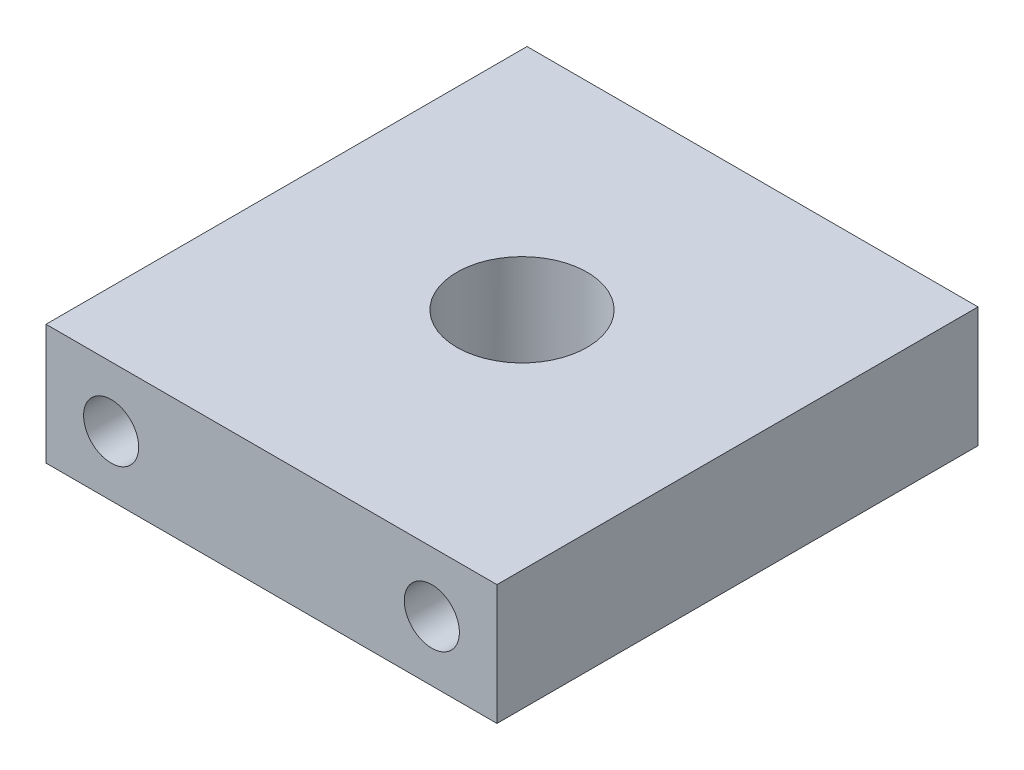
ISO-10303-21;
HEADER;
FILE_DESCRIPTION(('STEP AP214'),'2;1');
FILE_NAME('part.step','',(''),(''),'','','');
FILE_SCHEMA(('AUTOMOTIVE_DESIGN { 1 0 10303 214 1 1 1 1 }'));
ENDSEC;
DATA;
#1=APPLICATION_CONTEXT('core data for automotive mechanical design processes');
#2=APPLICATION_PROTOCOL_DEFINITION('international standard','automotive_design',2000,#1);
#3=PRODUCT_CONTEXT('',#1,'mechanical');
#4=PRODUCT('Part','Part','',(#3));
#5=PRODUCT_RELATED_PRODUCT_CATEGORY('part','',(#4));
#6=PRODUCT_DEFINITION_FORMATION('','',#4);
#7=PRODUCT_DEFINITION_CONTEXT('part definition',#1,'design');
#8=PRODUCT_DEFINITION('design','',#6,#7);
#9=PRODUCT_DEFINITION_SHAPE('','',#8);
#10=(LENGTH_UNIT() NAMED_UNIT(*) SI_UNIT(.MILLI.,.METRE.));
#11=(NAMED_UNIT(*) PLANE_ANGLE_UNIT() SI_UNIT($,.RADIAN.));
#12=(NAMED_UNIT(*) SI_UNIT($,.STERADIAN.) SOLID_ANGLE_UNIT());
#13=UNCERTAINTY_MEASURE_WITH_UNIT(LENGTH_MEASURE(1.E-05),#10,'distance_accuracy_value','');
#14=(GEOMETRIC_REPRESENTATION_CONTEXT(3) GLOBAL_UNCERTAINTY_ASSIGNED_CONTEXT((#13)) GLOBAL_UNIT_ASSIGNED_CONTEXT((#10,
#11,#12)) REPRESENTATION_CONTEXT('',''));
#15=CARTESIAN_POINT('',(0.,0.,0.));
#16=DIRECTION('',(0.,0.,1.));
#17=DIRECTION('',(1.,0.,0.));
#18=AXIS2_PLACEMENT_3D('',#15,#16,#17);
#19=CARTESIAN_POINT('',(0.,12.,0.));
#20=DIRECTION('',(1.,0.,0.));
#21=DIRECTION('',(0.,0.,-1.));
#22=AXIS2_PLACEMENT_3D('',#19,#20,#21);
#23=PLANE('',#22);
#24=DIRECTION('',(0.,0.,1.));
#25=VECTOR('',#24,1.);
#26=CARTESIAN_POINT('',(0.,0.,0.));
#27=LINE('',#26,#25);
#28=CARTESIAN_POINT('',(0.,0.,-48.));
#29=VERTEX_POINT('',#28);
#30=CARTESIAN_POINT('',(0.,0.,0.));
#31=VERTEX_POINT('',#30);
#32=EDGE_CURVE('E95',#29,#31,#27,.T.);
#33=ORIENTED_EDGE('',*,*,#32,.T.);
#34=DIRECTION('',(0.,-1.,0.));
#35=VECTOR('',#34,1.);
#36=CARTESIAN_POINT('',(0.,12.,0.));
#37=LINE('',#36,#35);
#38=CARTESIAN_POINT('',(0.,12.,0.));
#39=VERTEX_POINT('',#38);
#40=EDGE_CURVE('E11',#39,#31,#37,.T.);
#41=ORIENTED_EDGE('',*,*,#40,.F.);
#42=DIRECTION('',(0.,0.,1.));
#43=VECTOR('',#42,1.);
#44=CARTESIAN_POINT('',(0.,12.,0.));
#45=LINE('',#44,#43);
#46=CARTESIAN_POINT('',(0.,12.,-48.));
#47=VERTEX_POINT('',#46);
#48=EDGE_CURVE('E83',#47,#39,#45,.T.);
#49=ORIENTED_EDGE('',*,*,#48,.F.);
#50=DIRECTION('',(0.,-1.,0.));
#51=VECTOR('',#50,1.);
#52=CARTESIAN_POINT('',(0.,12.,-48.));
#53=LINE('',#52,#51);
#54=EDGE_CURVE('E91',#47,#29,#53,.T.);
#55=ORIENTED_EDGE('',*,*,#54,.T.);
#56=EDGE_LOOP('',(#33,#41,#49,#55));
#57=FACE_BOUND('',#56,.T.);
#58=ADVANCED_FACE('F32',(#57),#23,.F.);
#59=CARTESIAN_POINT('',(0.,12.,0.));
#60=DIRECTION('',(0.,0.,-1.));
#61=DIRECTION('',(-1.,0.,0.));
#62=AXIS2_PLACEMENT_3D('',#59,#60,#61);
#63=PLANE('',#62);
#64=CARTESIAN_POINT('',(38.5,6.,0.));
#65=DIRECTION('',(0.,0.,-1.));
#66=DIRECTION('',(-1.,0.,0.));
#67=AXIS2_PLACEMENT_3D('',#64,#65,#66);
#68=CIRCLE('',#67,2.74999999999999);
#69=CARTESIAN_POINT('',(35.75,6.,0.));
#70=VERTEX_POINT('',#69);
#71=EDGE_CURVE('E126',#70,#70,#68,.T.);
#72=ORIENTED_EDGE('',*,*,#71,.T.);
#73=EDGE_LOOP('',(#72));
#74=FACE_BOUND('',#73,.T.);
#75=CARTESIAN_POINT('',(6.5,6.,0.));
#76=DIRECTION('',(0.,0.,-1.));
#77=DIRECTION('',(-1.,0.,0.));
#78=AXIS2_PLACEMENT_3D('',#75,#76,#77);
#79=CIRCLE('',#78,2.74999999999999);
#80=CARTESIAN_POINT('',(3.75000000000001,6.,0.));
#81=VERTEX_POINT('',#80);
#82=EDGE_CURVE('E114',#81,#81,#79,.T.);
#83=ORIENTED_EDGE('',*,*,#82,.T.);
#84=EDGE_LOOP('',(#83));
#85=FACE_BOUND('',#84,.T.);
#86=DIRECTION('',(1.,0.,0.));
#87=VECTOR('',#86,1.);
#88=CARTESIAN_POINT('',(0.,0.,0.));
#89=LINE('',#88,#87);
#90=CARTESIAN_POINT('',(45.,0.,0.));
#91=VERTEX_POINT('',#90);
#92=EDGE_CURVE('E87',#31,#91,#89,.T.);
#93=ORIENTED_EDGE('',*,*,#92,.T.);
#94=DIRECTION('',(0.,-1.,0.));
#95=VECTOR('',#94,1.);
#96=CARTESIAN_POINT('',(45.,12.,0.));
#97=LINE('',#96,#95);
#98=CARTESIAN_POINT('',(45.,12.,0.));
#99=VERTEX_POINT('',#98);
#100=EDGE_CURVE('E40',#99,#91,#97,.T.);
#101=ORIENTED_EDGE('',*,*,#100,.F.);
#102=DIRECTION('',(1.,0.,0.));
#103=VECTOR('',#102,1.);
#104=CARTESIAN_POINT('',(0.,12.,0.));
#105=LINE('',#104,#103);
#106=EDGE_CURVE('E78',#39,#99,#105,.T.);
#107=ORIENTED_EDGE('',*,*,#106,.F.);
#108=ORIENTED_EDGE('',*,*,#40,.T.);
#109=EDGE_LOOP('',(#93,#101,#107,#108));
#110=FACE_BOUND('',#109,.T.);
#111=ADVANCED_FACE('F86',(#74,#85,#110),#63,.F.);
#112=CARTESIAN_POINT('',(45.,12.,0.));
#113=DIRECTION('',(-1.,0.,0.));
#114=DIRECTION('',(0.,0.,1.));
#115=AXIS2_PLACEMENT_3D('',#112,#113,#114);
#116=PLANE('',#115);
#117=DIRECTION('',(0.,0.,-1.));
#118=VECTOR('',#117,1.);
#119=CARTESIAN_POINT('',(45.,0.,0.));
#120=LINE('',#119,#118);
#121=CARTESIAN_POINT('',(45.,0.,-48.));
#122=VERTEX_POINT('',#121);
#123=EDGE_CURVE('E65',#91,#122,#120,.T.);
#124=ORIENTED_EDGE('',*,*,#123,.T.);
#125=DIRECTION('',(0.,-1.,0.));
#126=VECTOR('',#125,1.);
#127=CARTESIAN_POINT('',(45.,12.,-48.));
#128=LINE('',#127,#126);
#129=CARTESIAN_POINT('',(45.,12.,-48.));
#130=VERTEX_POINT('',#129);
#131=EDGE_CURVE('E88',#130,#122,#128,.T.);
#132=ORIENTED_EDGE('',*,*,#131,.F.);
#133=DIRECTION('',(0.,0.,-1.));
#134=VECTOR('',#133,1.);
#135=CARTESIAN_POINT('',(45.,12.,0.));
#136=LINE('',#135,#134);
#137=EDGE_CURVE('E81',#99,#130,#136,.T.);
#138=ORIENTED_EDGE('',*,*,#137,.F.);
#139=ORIENTED_EDGE('',*,*,#100,.T.);
#140=EDGE_LOOP('',(#124,#132,#138,#139));
#141=FACE_BOUND('',#140,.T.);
#142=ADVANCED_FACE('F89',(#141),#116,.F.);
#143=CARTESIAN_POINT('',(0.,12.,-48.));
#144=DIRECTION('',(0.,0.,1.));
#145=DIRECTION('',(1.,0.,0.));
#146=AXIS2_PLACEMENT_3D('',#143,#144,#145);
#147=PLANE('',#146);
#148=CARTESIAN_POINT('',(38.5,6.,-48.));
#149=DIRECTION('',(0.,0.,-1.));
#150=DIRECTION('',(-1.,0.,0.));
#151=AXIS2_PLACEMENT_3D('',#148,#149,#150);
#152=CIRCLE('',#151,4.75);
#153=CARTESIAN_POINT('',(33.75,6.,-48.));
#154=VERTEX_POINT('',#153);
#155=EDGE_CURVE('E135',#154,#154,#152,.T.);
#156=ORIENTED_EDGE('',*,*,#155,.F.);
#157=EDGE_LOOP('',(#156));
#158=FACE_BOUND('',#157,.T.);
#159=CARTESIAN_POINT('',(6.5,6.,-48.));
#160=DIRECTION('',(0.,0.,-1.));
#161=DIRECTION('',(-1.,0.,0.));
#162=AXIS2_PLACEMENT_3D('',#159,#160,#161);
#163=CIRCLE('',#162,4.75);
#164=CARTESIAN_POINT('',(1.75,6.,-48.));
#165=VERTEX_POINT('',#164);
#166=EDGE_CURVE('E123',#165,#165,#163,.T.);
#167=ORIENTED_EDGE('',*,*,#166,.F.);
#168=EDGE_LOOP('',(#167));
#169=FACE_BOUND('',#168,.T.);
#170=DIRECTION('',(-1.,0.,0.));
#171=VECTOR('',#170,1.);
#172=CARTESIAN_POINT('',(0.,0.,-48.));
#173=LINE('',#172,#171);
#174=EDGE_CURVE('E71',#122,#29,#173,.T.);
#175=ORIENTED_EDGE('',*,*,#174,.T.);
#176=ORIENTED_EDGE('',*,*,#54,.F.);
#177=DIRECTION('',(-1.,0.,0.));
#178=VECTOR('',#177,1.);
#179=CARTESIAN_POINT('',(0.,12.,-48.));
#180=LINE('',#179,#178);
#181=EDGE_CURVE('E48',#130,#47,#180,.T.);
#182=ORIENTED_EDGE('',*,*,#181,.F.);
#183=ORIENTED_EDGE('',*,*,#131,.T.);
#184=EDGE_LOOP('',(#175,#176,#182,#183));
#185=FACE_BOUND('',#184,.T.);
#186=ADVANCED_FACE('F103',(#158,#169,#185),#147,.F.);
#187=CARTESIAN_POINT('',(0.,12.,0.));
#188=DIRECTION('',(0.,-1.,0.));
#189=DIRECTION('',(0.,0.,-1.));
#190=AXIS2_PLACEMENT_3D('',#187,#188,#189);
#191=PLANE('',#190);
#192=CARTESIAN_POINT('',(22.5,12.,-25.));
#193=DIRECTION('',(0.,1.,0.));
#194=DIRECTION('',(0.,0.,1.));
#195=AXIS2_PLACEMENT_3D('',#192,#193,#194);
#196=CIRCLE('',#195,6.50000000000001);
#197=CARTESIAN_POINT('',(22.5,12.,-18.5));
#198=VERTEX_POINT('',#197);
#199=EDGE_CURVE('E111',#198,#198,#196,.T.);
#200=ORIENTED_EDGE('',*,*,#199,.F.);
#201=EDGE_LOOP('',(#200));
#202=FACE_BOUND('',#201,.T.);
#203=ORIENTED_EDGE('',*,*,#48,.T.);
#204=ORIENTED_EDGE('',*,*,#106,.T.);
#205=ORIENTED_EDGE('',*,*,#137,.T.);
#206=ORIENTED_EDGE('',*,*,#181,.T.);
#207=EDGE_LOOP('',(#203,#204,#205,#206));
#208=FACE_BOUND('',#207,.T.);
#209=ADVANCED_FACE('F79',(#202,#208),#191,.F.);
#210=CARTESIAN_POINT('',(0.,0.,0.));
#211=DIRECTION('',(0.,-1.,0.));
#212=DIRECTION('',(0.,0.,-1.));
#213=AXIS2_PLACEMENT_3D('',#210,#211,#212);
#214=PLANE('',#213);
#215=CARTESIAN_POINT('',(30.5,0.,-43.));
#216=DIRECTION('',(0.,-1.,0.));
#217=DIRECTION('',(0.,0.,-1.));
#218=AXIS2_PLACEMENT_3D('',#215,#216,#217);
#219=CIRCLE('',#218,3.);
#220=CARTESIAN_POINT('',(30.5,0.,-46.));
#221=VERTEX_POINT('',#220);
#222=EDGE_CURVE('E145',#221,#221,#219,.T.);
#223=ORIENTED_EDGE('',*,*,#222,.F.);
#224=EDGE_LOOP('',(#223));
#225=FACE_BOUND('',#224,.T.);
#226=CARTESIAN_POINT('',(14.5,0.,-43.));
#227=DIRECTION('',(0.,-1.,0.));
#228=DIRECTION('',(0.,0.,-1.));
#229=AXIS2_PLACEMENT_3D('',#226,#227,#228);
#230=CIRCLE('',#229,3.);
#231=CARTESIAN_POINT('',(14.5,0.,-46.));
#232=VERTEX_POINT('',#231);
#233=EDGE_CURVE('E139',#232,#232,#230,.T.);
#234=ORIENTED_EDGE('',*,*,#233,.F.);
#235=EDGE_LOOP('',(#234));
#236=FACE_BOUND('',#235,.T.);
#237=CARTESIAN_POINT('',(22.5,0.,-25.));
#238=DIRECTION('',(0.,-1.,0.));
#239=DIRECTION('',(0.,0.,-1.));
#240=AXIS2_PLACEMENT_3D('',#237,#238,#239);
#241=CIRCLE('',#240,6.50000000000001);
#242=CARTESIAN_POINT('',(22.5,0.,-31.5));
#243=VERTEX_POINT('',#242);
#244=EDGE_CURVE('E98',#243,#243,#241,.F.);
#245=ORIENTED_EDGE('',*,*,#244,.T.);
#246=EDGE_LOOP('',(#245));
#247=FACE_BOUND('',#246,.T.);
#248=ORIENTED_EDGE('',*,*,#32,.F.);
#249=ORIENTED_EDGE('',*,*,#174,.F.);
#250=ORIENTED_EDGE('',*,*,#123,.F.);
#251=ORIENTED_EDGE('',*,*,#92,.F.);
#252=EDGE_LOOP('',(#248,#249,#250,#251));
#253=FACE_BOUND('',#252,.T.);
#254=ADVANCED_FACE('F106',(#225,#236,#247,#253),#214,.T.);
#255=CARTESIAN_POINT('',(22.5,-18.3847763108503,-25.));
#256=DIRECTION('',(0.,1.,0.));
#257=DIRECTION('',(0.,0.,1.));
#258=AXIS2_PLACEMENT_3D('',#255,#256,#257);
#259=CYLINDRICAL_SURFACE('',#258,6.50000000000001);
#260=ORIENTED_EDGE('',*,*,#199,.T.);
#261=EDGE_LOOP('',(#260));
#262=FACE_BOUND('',#261,.T.);
#263=ORIENTED_EDGE('',*,*,#244,.F.);
#264=EDGE_LOOP('',(#263));
#265=FACE_BOUND('',#264,.T.);
#266=ADVANCED_FACE('F162',(#262,#265),#259,.F.);
#267=CARTESIAN_POINT('',(6.5,6.,-48.));
#268=DIRECTION('',(0.,0.,-1.));
#269=DIRECTION('',(-1.,0.,0.));
#270=AXIS2_PLACEMENT_3D('',#267,#268,#269);
#271=CYLINDRICAL_SURFACE('',#270,2.74999999999999);
#272=ORIENTED_EDGE('',*,*,#82,.F.);
#273=EDGE_LOOP('',(#272));
#274=FACE_BOUND('',#273,.T.);
#275=CARTESIAN_POINT('',(6.5,6.,-18.));
#276=DIRECTION('',(0.,0.,-1.));
#277=DIRECTION('',(-1.,0.,0.));
#278=AXIS2_PLACEMENT_3D('',#275,#276,#277);
#279=CIRCLE('',#278,2.75);
#280=CARTESIAN_POINT('',(3.75,6.,-18.));
#281=VERTEX_POINT('',#280);
#282=EDGE_CURVE('E117',#281,#281,#279,.T.);
#283=ORIENTED_EDGE('',*,*,#282,.T.);
#284=EDGE_LOOP('',(#283));
#285=FACE_BOUND('',#284,.T.);
#286=ADVANCED_FACE('F169',(#274,#285),#271,.F.);
#287=CARTESIAN_POINT('',(9.24999999999999,6.,-18.));
#288=DIRECTION('',(0.,0.,1.));
#289=DIRECTION('',(1.,0.,0.));
#290=AXIS2_PLACEMENT_3D('',#287,#288,#289);
#291=PLANE('',#290);
#292=ORIENTED_EDGE('',*,*,#282,.F.);
#293=EDGE_LOOP('',(#292));
#294=FACE_BOUND('',#293,.T.);
#295=CARTESIAN_POINT('',(6.5,6.,-18.));
#296=DIRECTION('',(0.,0.,-1.));
#297=DIRECTION('',(-1.,0.,0.));
#298=AXIS2_PLACEMENT_3D('',#295,#296,#297);
#299=CIRCLE('',#298,4.74999999999999);
#300=CARTESIAN_POINT('',(1.75000000000001,6.,-18.));
#301=VERTEX_POINT('',#300);
#302=EDGE_CURVE('E120',#301,#301,#299,.T.);
#303=ORIENTED_EDGE('',*,*,#302,.T.);
#304=EDGE_LOOP('',(#303));
#305=FACE_BOUND('',#304,.T.);
#306=ADVANCED_FACE('F175',(#294,#305),#291,.F.);
#307=CARTESIAN_POINT('',(6.5,6.,-48.));
#308=DIRECTION('',(0.,0.,-1.));
#309=DIRECTION('',(-1.,0.,0.));
#310=AXIS2_PLACEMENT_3D('',#307,#308,#309);
#311=CYLINDRICAL_SURFACE('',#310,4.74999999999999);
#312=ORIENTED_EDGE('',*,*,#302,.F.);
#313=EDGE_LOOP('',(#312));
#314=FACE_BOUND('',#313,.T.);
#315=ORIENTED_EDGE('',*,*,#166,.T.);
#316=EDGE_LOOP('',(#315));
#317=FACE_BOUND('',#316,.T.);
#318=ADVANCED_FACE('F258',(#314,#317),#311,.F.);
#319=CARTESIAN_POINT('',(38.5,6.,-48.));
#320=DIRECTION('',(0.,0.,-1.));
#321=DIRECTION('',(-1.,0.,0.));
#322=AXIS2_PLACEMENT_3D('',#319,#320,#321);
#323=CYLINDRICAL_SURFACE('',#322,2.74999999999999);
#324=ORIENTED_EDGE('',*,*,#71,.F.);
#325=EDGE_LOOP('',(#324));
#326=FACE_BOUND('',#325,.T.);
#327=CARTESIAN_POINT('',(38.5,6.,-18.));
#328=DIRECTION('',(0.,0.,-1.));
#329=DIRECTION('',(-1.,0.,0.));
#330=AXIS2_PLACEMENT_3D('',#327,#328,#329);
#331=CIRCLE('',#330,2.75);
#332=CARTESIAN_POINT('',(35.75,6.,-18.));
#333=VERTEX_POINT('',#332);
#334=EDGE_CURVE('E129',#333,#333,#331,.T.);
#335=ORIENTED_EDGE('',*,*,#334,.T.);
#336=EDGE_LOOP('',(#335));
#337=FACE_BOUND('',#336,.T.);
#338=ADVANCED_FACE('F254',(#326,#337),#323,.F.);
#339=CARTESIAN_POINT('',(41.25,6.,-18.));
#340=DIRECTION('',(0.,0.,1.));
#341=DIRECTION('',(1.,0.,0.));
#342=AXIS2_PLACEMENT_3D('',#339,#340,#341);
#343=PLANE('',#342);
#344=ORIENTED_EDGE('',*,*,#334,.F.);
#345=EDGE_LOOP('',(#344));
#346=FACE_BOUND('',#345,.T.);
#347=CARTESIAN_POINT('',(38.5,6.,-18.));
#348=DIRECTION('',(0.,0.,-1.));
#349=DIRECTION('',(-1.,0.,0.));
#350=AXIS2_PLACEMENT_3D('',#347,#348,#349);
#351=CIRCLE('',#350,4.74999999999999);
#352=CARTESIAN_POINT('',(33.75,6.,-18.));
#353=VERTEX_POINT('',#352);
#354=EDGE_CURVE('E132',#353,#353,#351,.T.);
#355=ORIENTED_EDGE('',*,*,#354,.T.);
#356=EDGE_LOOP('',(#355));
#357=FACE_BOUND('',#356,.T.);
#358=ADVANCED_FACE('F250',(#346,#357),#343,.F.);
#359=CARTESIAN_POINT('',(38.5,6.,-48.));
#360=DIRECTION('',(0.,0.,-1.));
#361=DIRECTION('',(-1.,0.,0.));
#362=AXIS2_PLACEMENT_3D('',#359,#360,#361);
#363=CYLINDRICAL_SURFACE('',#362,4.74999999999999);
#364=ORIENTED_EDGE('',*,*,#354,.F.);
#365=EDGE_LOOP('',(#364));
#366=FACE_BOUND('',#365,.T.);
#367=ORIENTED_EDGE('',*,*,#155,.T.);
#368=EDGE_LOOP('',(#367));
#369=FACE_BOUND('',#368,.T.);
#370=ADVANCED_FACE('F211',(#366,#369),#363,.F.);
#371=CARTESIAN_POINT('',(14.5,8.,-43.));
#372=DIRECTION('',(0.,-1.,0.));
#373=DIRECTION('',(0.,0.,-1.));
#374=AXIS2_PLACEMENT_3D('',#371,#372,#373);
#375=CYLINDRICAL_SURFACE('',#374,3.);
#376=CARTESIAN_POINT('',(14.5,8.,-43.));
#377=DIRECTION('',(0.,-1.,0.));
#378=DIRECTION('',(0.,0.,-1.));
#379=AXIS2_PLACEMENT_3D('',#376,#377,#378);
#380=CIRCLE('',#379,3.);
#381=CARTESIAN_POINT('',(14.5,8.,-46.));
#382=VERTEX_POINT('',#381);
#383=EDGE_CURVE('E138',#382,#382,#380,.T.);
#384=ORIENTED_EDGE('',*,*,#383,.F.);
#385=EDGE_LOOP('',(#384));
#386=FACE_BOUND('',#385,.T.);
#387=ORIENTED_EDGE('',*,*,#233,.T.);
#388=EDGE_LOOP('',(#387));
#389=FACE_BOUND('',#388,.T.);
#390=ADVANCED_FACE('F216',(#386,#389),#375,.F.);
#391=CARTESIAN_POINT('',(14.5,8.,-43.));
#392=DIRECTION('',(0.,-1.,0.));
#393=DIRECTION('',(0.,0.,-1.));
#394=AXIS2_PLACEMENT_3D('',#391,#392,#393);
#395=PLANE('',#394);
#396=ORIENTED_EDGE('',*,*,#383,.T.);
#397=EDGE_LOOP('',(#396));
#398=FACE_BOUND('',#397,.T.);
#399=ADVANCED_FACE('F156',(#398),#395,.T.);
#400=CARTESIAN_POINT('',(30.5,8.,-43.));
#401=DIRECTION('',(0.,-1.,0.));
#402=DIRECTION('',(0.,0.,-1.));
#403=AXIS2_PLACEMENT_3D('',#400,#401,#402);
#404=CYLINDRICAL_SURFACE('',#403,3.);
#405=CARTESIAN_POINT('',(30.5,8.,-43.));
#406=DIRECTION('',(0.,-1.,0.));
#407=DIRECTION('',(0.,0.,-1.));
#408=AXIS2_PLACEMENT_3D('',#405,#406,#407);
#409=CIRCLE('',#408,3.);
#410=CARTESIAN_POINT('',(30.5,8.,-46.));
#411=VERTEX_POINT('',#410);
#412=EDGE_CURVE('E142',#411,#411,#409,.T.);
#413=ORIENTED_EDGE('',*,*,#412,.F.);
#414=EDGE_LOOP('',(#413));
#415=FACE_BOUND('',#414,.T.);
#416=ORIENTED_EDGE('',*,*,#222,.T.);
#417=EDGE_LOOP('',(#416));
#418=FACE_BOUND('',#417,.T.);
#419=ADVANCED_FACE('F153',(#415,#418),#404,.F.);
#420=CARTESIAN_POINT('',(30.5,8.,-43.));
#421=DIRECTION('',(0.,-1.,0.));
#422=DIRECTION('',(0.,0.,-1.));
#423=AXIS2_PLACEMENT_3D('',#420,#421,#422);
#424=PLANE('',#423);
#425=ORIENTED_EDGE('',*,*,#412,.T.);
#426=EDGE_LOOP('',(#425));
#427=FACE_BOUND('',#426,.T.);
#428=ADVANCED_FACE('F151',(#427),#424,.T.);
#429=CLOSED_SHELL('',(#58,#111,#142,#186,#209,#254,#266,#286,#306,#318,#338,#358,#370,#390,#399,
#419,#428));
#430=MANIFOLD_SOLID_BREP('B2',#429);
#431=ADVANCED_BREP_SHAPE_REPRESENTATION('',(#18,#430),#14);
#432=SHAPE_DEFINITION_REPRESENTATION(#9,#431);
ENDSEC;
END-ISO-10303-21;
